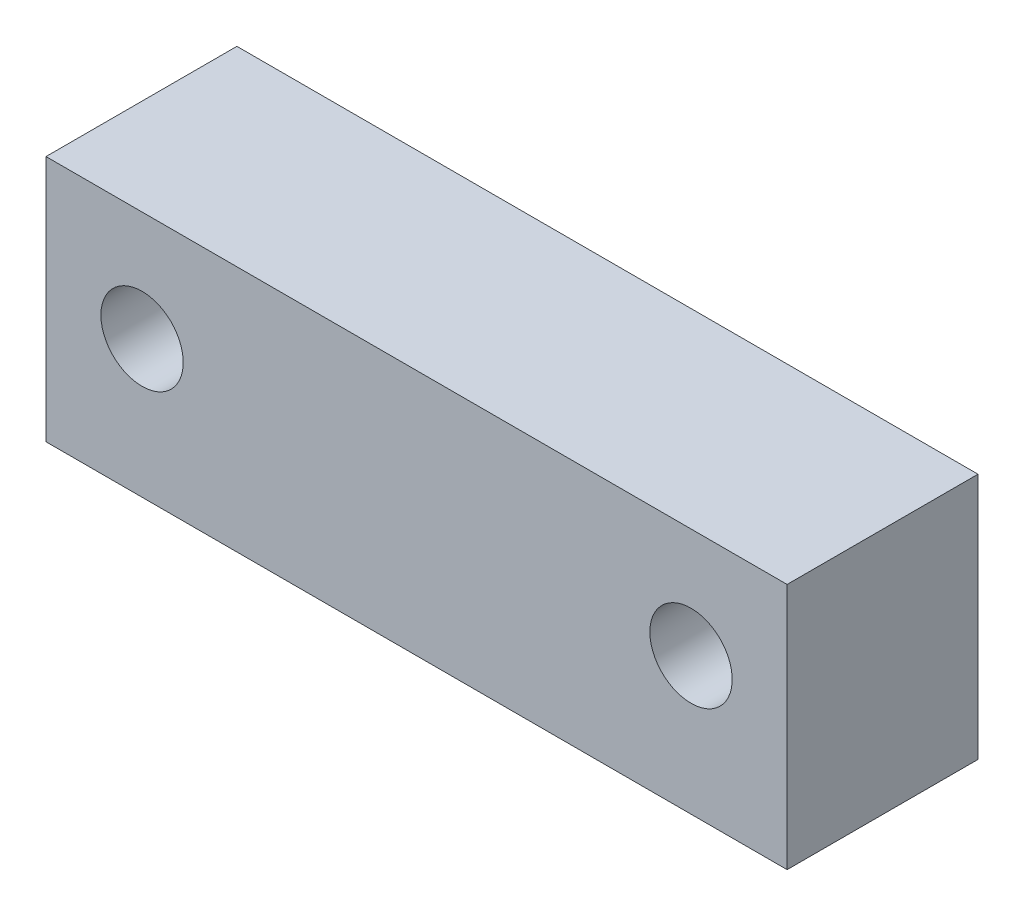
ISO-10303-21;
HEADER;
FILE_DESCRIPTION(('STEP AP214'),'2;1');
FILE_NAME('part.step','',(''),(''),'','','');
FILE_SCHEMA(('AUTOMOTIVE_DESIGN { 1 0 10303 214 1 1 1 1 }'));
ENDSEC;
DATA;
#1=APPLICATION_CONTEXT('core data for automotive mechanical design processes');
#2=APPLICATION_PROTOCOL_DEFINITION('international standard','automotive_design',2000,#1);
#3=PRODUCT_CONTEXT('',#1,'mechanical');
#4=PRODUCT('Part','Part','',(#3));
#5=PRODUCT_RELATED_PRODUCT_CATEGORY('part','',(#4));
#6=PRODUCT_DEFINITION_FORMATION('','',#4);
#7=PRODUCT_DEFINITION_CONTEXT('part definition',#1,'design');
#8=PRODUCT_DEFINITION('design','',#6,#7);
#9=PRODUCT_DEFINITION_SHAPE('','',#8);
#10=(LENGTH_UNIT() NAMED_UNIT(*) SI_UNIT(.MILLI.,.METRE.));
#11=(NAMED_UNIT(*) PLANE_ANGLE_UNIT() SI_UNIT($,.RADIAN.));
#12=(NAMED_UNIT(*) SI_UNIT($,.STERADIAN.) SOLID_ANGLE_UNIT());
#13=UNCERTAINTY_MEASURE_WITH_UNIT(LENGTH_MEASURE(1.E-05),#10,'distance_accuracy_value','');
#14=(GEOMETRIC_REPRESENTATION_CONTEXT(3) GLOBAL_UNCERTAINTY_ASSIGNED_CONTEXT((#13)) GLOBAL_UNIT_ASSIGNED_CONTEXT((#10,
#11,#12)) REPRESENTATION_CONTEXT('',''));
#15=CARTESIAN_POINT('',(0.,0.,0.));
#16=DIRECTION('',(0.,0.,1.));
#17=DIRECTION('',(1.,0.,0.));
#18=AXIS2_PLACEMENT_3D('',#15,#16,#17);
#19=CARTESIAN_POINT('',(0.,0.,13.91));
#20=DIRECTION('',(0.,0.,-1.));
#21=DIRECTION('',(-1.,0.,0.));
#22=AXIS2_PLACEMENT_3D('',#19,#20,#21);
#23=PLANE('',#22);
#24=DIRECTION('',(1.,0.,0.));
#25=VECTOR('',#24,1.);
#26=CARTESIAN_POINT('',(-27.,-18.,13.91));
#27=LINE('',#26,#25);
#28=CARTESIAN_POINT('',(-27.,-18.,13.91));
#29=VERTEX_POINT('',#28);
#30=CARTESIAN_POINT('',(27.,-18.,13.91));
#31=VERTEX_POINT('',#30);
#32=EDGE_CURVE('E84',#29,#31,#27,.T.);
#33=ORIENTED_EDGE('',*,*,#32,.T.);
#34=DIRECTION('',(0.,1.,0.));
#35=VECTOR('',#34,1.);
#36=CARTESIAN_POINT('',(27.,0.,13.91));
#37=LINE('',#36,#35);
#38=CARTESIAN_POINT('',(27.,0.,13.91));
#39=VERTEX_POINT('',#38);
#40=EDGE_CURVE('E79',#31,#39,#37,.T.);
#41=ORIENTED_EDGE('',*,*,#40,.T.);
#42=DIRECTION('',(-1.,0.,0.));
#43=VECTOR('',#42,1.);
#44=CARTESIAN_POINT('',(-27.,0.,13.91));
#45=LINE('',#44,#43);
#46=CARTESIAN_POINT('',(-27.,0.,13.91));
#47=VERTEX_POINT('',#46);
#48=EDGE_CURVE('E82',#39,#47,#45,.T.);
#49=ORIENTED_EDGE('',*,*,#48,.T.);
#50=DIRECTION('',(0.,-1.,0.));
#51=VECTOR('',#50,1.);
#52=CARTESIAN_POINT('',(-27.,0.,13.91));
#53=LINE('',#52,#51);
#54=EDGE_CURVE('E49',#47,#29,#53,.T.);
#55=ORIENTED_EDGE('',*,*,#54,.T.);
#56=EDGE_LOOP('',(#33,#41,#49,#55));
#57=FACE_BOUND('',#56,.T.);
#58=CARTESIAN_POINT('',(-20.,-8.,13.91));
#59=DIRECTION('',(0.,0.,1.));
#60=DIRECTION('',(1.,0.,0.));
#61=AXIS2_PLACEMENT_3D('',#58,#59,#60);
#62=CIRCLE('',#61,2.99999999999999);
#63=CARTESIAN_POINT('',(-23.,-8.,13.91));
#64=VERTEX_POINT('',#63);
#65=EDGE_CURVE('E99',#64,#64,#62,.T.);
#66=ORIENTED_EDGE('',*,*,#65,.F.);
#67=EDGE_LOOP('',(#66));
#68=FACE_BOUND('',#67,.T.);
#69=CARTESIAN_POINT('',(20.,-8.,13.91));
#70=DIRECTION('',(0.,0.,1.));
#71=DIRECTION('',(1.,0.,0.));
#72=AXIS2_PLACEMENT_3D('',#69,#70,#71);
#73=CIRCLE('',#72,2.99999999999999);
#74=CARTESIAN_POINT('',(17.,-8.,13.91));
#75=VERTEX_POINT('',#74);
#76=EDGE_CURVE('E114',#75,#75,#73,.T.);
#77=ORIENTED_EDGE('',*,*,#76,.F.);
#78=EDGE_LOOP('',(#77));
#79=FACE_BOUND('',#78,.T.);
#80=ADVANCED_FACE('F32',(#57,#68,#79),#23,.F.);
#81=CARTESIAN_POINT('',(0.,0.,0.));
#82=DIRECTION('',(0.,0.,-1.));
#83=DIRECTION('',(-1.,0.,0.));
#84=AXIS2_PLACEMENT_3D('',#81,#82,#83);
#85=PLANE('',#84);
#86=CARTESIAN_POINT('',(-20.,-8.,0.));
#87=DIRECTION('',(0.,0.,1.));
#88=DIRECTION('',(1.,0.,0.));
#89=AXIS2_PLACEMENT_3D('',#86,#87,#88);
#90=CIRCLE('',#89,2.99999999999999);
#91=CARTESIAN_POINT('',(-23.,-8.,0.));
#92=VERTEX_POINT('',#91);
#93=EDGE_CURVE('E111',#92,#92,#90,.T.);
#94=ORIENTED_EDGE('',*,*,#93,.T.);
#95=EDGE_LOOP('',(#94));
#96=FACE_BOUND('',#95,.T.);
#97=DIRECTION('',(1.,0.,0.));
#98=VECTOR('',#97,1.);
#99=CARTESIAN_POINT('',(-27.,-18.,0.));
#100=LINE('',#99,#98);
#101=CARTESIAN_POINT('',(-27.,-18.,0.));
#102=VERTEX_POINT('',#101);
#103=CARTESIAN_POINT('',(27.,-18.,0.));
#104=VERTEX_POINT('',#103);
#105=EDGE_CURVE('E96',#102,#104,#100,.T.);
#106=ORIENTED_EDGE('',*,*,#105,.F.);
#107=DIRECTION('',(0.,-1.,0.));
#108=VECTOR('',#107,1.);
#109=CARTESIAN_POINT('',(-27.,0.,0.));
#110=LINE('',#109,#108);
#111=CARTESIAN_POINT('',(-27.,0.,0.));
#112=VERTEX_POINT('',#111);
#113=EDGE_CURVE('E72',#112,#102,#110,.T.);
#114=ORIENTED_EDGE('',*,*,#113,.F.);
#115=DIRECTION('',(-1.,0.,0.));
#116=VECTOR('',#115,1.);
#117=CARTESIAN_POINT('',(-27.,0.,0.));
#118=LINE('',#117,#116);
#119=CARTESIAN_POINT('',(27.,0.,0.));
#120=VERTEX_POINT('',#119);
#121=EDGE_CURVE('E66',#120,#112,#118,.T.);
#122=ORIENTED_EDGE('',*,*,#121,.F.);
#123=DIRECTION('',(0.,1.,0.));
#124=VECTOR('',#123,1.);
#125=CARTESIAN_POINT('',(27.,0.,0.));
#126=LINE('',#125,#124);
#127=EDGE_CURVE('E88',#104,#120,#126,.T.);
#128=ORIENTED_EDGE('',*,*,#127,.F.);
#129=EDGE_LOOP('',(#106,#114,#122,#128));
#130=FACE_BOUND('',#129,.T.);
#131=CARTESIAN_POINT('',(20.,-8.,0.));
#132=DIRECTION('',(0.,0.,1.));
#133=DIRECTION('',(1.,0.,0.));
#134=AXIS2_PLACEMENT_3D('',#131,#132,#133);
#135=CIRCLE('',#134,2.99999999999999);
#136=CARTESIAN_POINT('',(17.,-8.,0.));
#137=VERTEX_POINT('',#136);
#138=EDGE_CURVE('E117',#137,#137,#135,.T.);
#139=ORIENTED_EDGE('',*,*,#138,.T.);
#140=EDGE_LOOP('',(#139));
#141=FACE_BOUND('',#140,.T.);
#142=ADVANCED_FACE('F107',(#96,#130,#141),#85,.T.);
#143=CARTESIAN_POINT('',(-27.,-18.,13.91));
#144=DIRECTION('',(0.,1.,0.));
#145=DIRECTION('',(0.,0.,1.));
#146=AXIS2_PLACEMENT_3D('',#143,#144,#145);
#147=PLANE('',#146);
#148=ORIENTED_EDGE('',*,*,#105,.T.);
#149=DIRECTION('',(0.,0.,-1.));
#150=VECTOR('',#149,1.);
#151=CARTESIAN_POINT('',(27.,-18.,13.91));
#152=LINE('',#151,#150);
#153=EDGE_CURVE('E11',#31,#104,#152,.T.);
#154=ORIENTED_EDGE('',*,*,#153,.F.);
#155=ORIENTED_EDGE('',*,*,#32,.F.);
#156=DIRECTION('',(0.,0.,-1.));
#157=VECTOR('',#156,1.);
#158=CARTESIAN_POINT('',(-27.,-18.,13.91));
#159=LINE('',#158,#157);
#160=EDGE_CURVE('E92',#29,#102,#159,.T.);
#161=ORIENTED_EDGE('',*,*,#160,.T.);
#162=EDGE_LOOP('',(#148,#154,#155,#161));
#163=FACE_BOUND('',#162,.T.);
#164=ADVANCED_FACE('F34',(#163),#147,.F.);
#165=CARTESIAN_POINT('',(27.,0.,13.91));
#166=DIRECTION('',(-1.,0.,0.));
#167=DIRECTION('',(0.,0.,1.));
#168=AXIS2_PLACEMENT_3D('',#165,#166,#167);
#169=PLANE('',#168);
#170=ORIENTED_EDGE('',*,*,#127,.T.);
#171=DIRECTION('',(0.,0.,-1.));
#172=VECTOR('',#171,1.);
#173=CARTESIAN_POINT('',(27.,0.,13.91));
#174=LINE('',#173,#172);
#175=EDGE_CURVE('E41',#39,#120,#174,.T.);
#176=ORIENTED_EDGE('',*,*,#175,.F.);
#177=ORIENTED_EDGE('',*,*,#40,.F.);
#178=ORIENTED_EDGE('',*,*,#153,.T.);
#179=EDGE_LOOP('',(#170,#176,#177,#178));
#180=FACE_BOUND('',#179,.T.);
#181=ADVANCED_FACE('F87',(#180),#169,.F.);
#182=CARTESIAN_POINT('',(-27.,0.,13.91));
#183=DIRECTION('',(0.,-1.,0.));
#184=DIRECTION('',(0.,0.,-1.));
#185=AXIS2_PLACEMENT_3D('',#182,#183,#184);
#186=PLANE('',#185);
#187=ORIENTED_EDGE('',*,*,#121,.T.);
#188=DIRECTION('',(0.,0.,-1.));
#189=VECTOR('',#188,1.);
#190=CARTESIAN_POINT('',(-27.,0.,13.91));
#191=LINE('',#190,#189);
#192=EDGE_CURVE('E89',#47,#112,#191,.T.);
#193=ORIENTED_EDGE('',*,*,#192,.F.);
#194=ORIENTED_EDGE('',*,*,#48,.F.);
#195=ORIENTED_EDGE('',*,*,#175,.T.);
#196=EDGE_LOOP('',(#187,#193,#194,#195));
#197=FACE_BOUND('',#196,.T.);
#198=ADVANCED_FACE('F90',(#197),#186,.F.);
#199=CARTESIAN_POINT('',(-27.,0.,13.91));
#200=DIRECTION('',(1.,0.,0.));
#201=DIRECTION('',(0.,1.,0.));
#202=AXIS2_PLACEMENT_3D('',#199,#200,#201);
#203=PLANE('',#202);
#204=ORIENTED_EDGE('',*,*,#113,.T.);
#205=ORIENTED_EDGE('',*,*,#160,.F.);
#206=ORIENTED_EDGE('',*,*,#54,.F.);
#207=ORIENTED_EDGE('',*,*,#192,.T.);
#208=EDGE_LOOP('',(#204,#205,#206,#207));
#209=FACE_BOUND('',#208,.T.);
#210=ADVANCED_FACE('F104',(#209),#203,.F.);
#211=CARTESIAN_POINT('',(-20.,-8.,13.91));
#212=DIRECTION('',(0.,0.,-1.));
#213=DIRECTION('',(-1.,0.,0.));
#214=AXIS2_PLACEMENT_3D('',#211,#212,#213);
#215=CYLINDRICAL_SURFACE('',#214,2.99999999999999);
#216=CARTESIAN_POINT('',(-23.,-8.,13.91));
#217=CARTESIAN_POINT('',(-23.,-8.,13.7651041666667));
#218=CARTESIAN_POINT('',(-23.,-8.,13.6202083333333));
#219=CARTESIAN_POINT('',(-23.,-8.,13.3304166666667));
#220=CARTESIAN_POINT('',(-23.,-8.,13.1855208333333));
#221=CARTESIAN_POINT('',(-23.,-8.,12.8957291666667));
#222=CARTESIAN_POINT('',(-23.,-8.,12.7508333333333));
#223=CARTESIAN_POINT('',(-23.,-8.,12.4610416666667));
#224=CARTESIAN_POINT('',(-23.,-8.,12.3161458333333));
#225=CARTESIAN_POINT('',(-23.,-8.,12.0263541666667));
#226=CARTESIAN_POINT('',(-23.,-8.,11.8814583333333));
#227=CARTESIAN_POINT('',(-23.,-8.,11.5916666666667));
#228=CARTESIAN_POINT('',(-23.,-8.,11.4467708333333));
#229=CARTESIAN_POINT('',(-23.,-8.,11.1569791666667));
#230=CARTESIAN_POINT('',(-23.,-8.,11.0120833333333));
#231=CARTESIAN_POINT('',(-23.,-8.,10.7222916666667));
#232=CARTESIAN_POINT('',(-23.,-8.,10.5773958333333));
#233=CARTESIAN_POINT('',(-23.,-8.,10.2876041666667));
#234=CARTESIAN_POINT('',(-23.,-8.,10.1427083333333));
#235=CARTESIAN_POINT('',(-23.,-8.,9.85291666666667));
#236=CARTESIAN_POINT('',(-23.,-8.,9.70802083333333));
#237=CARTESIAN_POINT('',(-23.,-8.,9.41822916666667));
#238=CARTESIAN_POINT('',(-23.,-8.,9.27333333333333));
#239=CARTESIAN_POINT('',(-23.,-8.,8.98354166666667));
#240=CARTESIAN_POINT('',(-23.,-8.,8.83864583333333));
#241=CARTESIAN_POINT('',(-23.,-8.,8.54885416666667));
#242=CARTESIAN_POINT('',(-23.,-8.,8.40395833333333));
#243=CARTESIAN_POINT('',(-23.,-8.,8.11416666666667));
#244=CARTESIAN_POINT('',(-23.,-8.,7.96927083333334));
#245=CARTESIAN_POINT('',(-23.,-8.,7.67947916666667));
#246=CARTESIAN_POINT('',(-23.,-8.,7.53458333333333));
#247=CARTESIAN_POINT('',(-23.,-8.,7.24479166666667));
#248=CARTESIAN_POINT('',(-23.,-8.,7.09989583333333));
#249=CARTESIAN_POINT('',(-23.,-8.,6.81010416666667));
#250=CARTESIAN_POINT('',(-23.,-8.,6.66520833333333));
#251=CARTESIAN_POINT('',(-23.,-8.,6.37541666666667));
#252=CARTESIAN_POINT('',(-23.,-8.,6.23052083333333));
#253=CARTESIAN_POINT('',(-23.,-8.,5.94072916666667));
#254=CARTESIAN_POINT('',(-23.,-8.,5.79583333333333));
#255=CARTESIAN_POINT('',(-23.,-8.,5.50604166666667));
#256=CARTESIAN_POINT('',(-23.,-8.,5.36114583333333));
#257=CARTESIAN_POINT('',(-23.,-8.,5.07135416666667));
#258=CARTESIAN_POINT('',(-23.,-8.,4.92645833333333));
#259=CARTESIAN_POINT('',(-23.,-8.,4.63666666666667));
#260=CARTESIAN_POINT('',(-23.,-8.,4.49177083333333));
#261=CARTESIAN_POINT('',(-23.,-8.,4.20197916666667));
#262=CARTESIAN_POINT('',(-23.,-8.,4.05708333333333));
#263=CARTESIAN_POINT('',(-23.,-8.,3.76729166666667));
#264=CARTESIAN_POINT('',(-23.,-8.,3.62239583333333));
#265=CARTESIAN_POINT('',(-23.,-8.,3.33260416666667));
#266=CARTESIAN_POINT('',(-23.,-8.,3.18770833333333));
#267=CARTESIAN_POINT('',(-23.,-8.,2.89791666666667));
#268=CARTESIAN_POINT('',(-23.,-8.,2.75302083333333));
#269=CARTESIAN_POINT('',(-23.,-8.,2.46322916666667));
#270=CARTESIAN_POINT('',(-23.,-8.,2.31833333333333));
#271=CARTESIAN_POINT('',(-23.,-8.,2.02854166666667));
#272=CARTESIAN_POINT('',(-23.,-8.,1.88364583333333));
#273=CARTESIAN_POINT('',(-23.,-8.,1.59385416666667));
#274=CARTESIAN_POINT('',(-23.,-8.,1.44895833333333));
#275=CARTESIAN_POINT('',(-23.,-8.,1.15916666666667));
#276=CARTESIAN_POINT('',(-23.,-8.,1.01427083333333));
#277=CARTESIAN_POINT('',(-23.,-8.,0.724479166666667));
#278=CARTESIAN_POINT('',(-23.,-8.,0.579583333333333));
#279=CARTESIAN_POINT('',(-23.,-8.,0.289791666666666));
#280=CARTESIAN_POINT('',(-23.,-8.,0.144895833333333));
#281=CARTESIAN_POINT('',(-23.,-8.,0.));
#282=B_SPLINE_CURVE_WITH_KNOTS('',3,(#216,#217,#218,#219,#220,#221,#222,#223,#224,#225,#226,
#227,#228,#229,#230,#231,#232,#233,#234,#235,#236,#237,#238,#239,#240,#241,#242,#243,#244,#245,
#246,#247,#248,#249,#250,#251,#252,#253,#254,#255,#256,#257,#258,#259,#260,#261,#262,#263,#264,
#265,#266,#267,#268,#269,#270,#271,#272,#273,#274,#275,#276,#277,#278,#279,#280,#281),
.UNSPECIFIED.,.F.,.F.,(4,2,2,2,2,2,2,2,2,2,2,2,2,2,2,2,2,2,2,2,2,2,2,2,2,2,2,2,2,2,2,2,4),(0.,
0.434687499999999,0.869374999999999,1.3040625,1.73875,2.1734375,2.608125,3.0428125,3.4775,
3.9121875,4.346875,4.7815625,5.21625,5.6509375,6.085625,6.5203125,6.955,7.3896875,7.824375,
8.2590625,8.69375,9.1284375,9.563125,9.9978125,10.4325,10.8671875,11.301875,11.7365625,12.17125,
12.6059375,13.040625,13.4753125,13.91),.UNSPECIFIED.);
#283=EDGE_CURVE('BSEAM134',#64,#92,#282,.T.);
#284=ORIENTED_EDGE('',*,*,#65,.T.);
#285=ORIENTED_EDGE('',*,*,#93,.F.);
#286=ORIENTED_EDGE('',*,*,#283,.T.);
#287=ORIENTED_EDGE('',*,*,#283,.F.);
#288=EDGE_LOOP('',(#284,#286,#285,#287));
#289=FACE_BOUND('',#288,.T.);
#290=ADVANCED_FACE('F134',(#289),#215,.F.);
#291=CARTESIAN_POINT('',(20.,-8.,13.91));
#292=DIRECTION('',(0.,0.,-1.));
#293=DIRECTION('',(-1.,0.,0.));
#294=AXIS2_PLACEMENT_3D('',#291,#292,#293);
#295=CYLINDRICAL_SURFACE('',#294,2.99999999999999);
#296=CARTESIAN_POINT('',(17.,-8.,13.91));
#297=CARTESIAN_POINT('',(17.,-8.,13.7651041666667));
#298=CARTESIAN_POINT('',(17.,-8.,13.6202083333333));
#299=CARTESIAN_POINT('',(17.,-8.,13.3304166666667));
#300=CARTESIAN_POINT('',(17.,-8.,13.1855208333333));
#301=CARTESIAN_POINT('',(17.,-8.,12.8957291666667));
#302=CARTESIAN_POINT('',(17.,-8.,12.7508333333333));
#303=CARTESIAN_POINT('',(17.,-8.,12.4610416666667));
#304=CARTESIAN_POINT('',(17.,-8.,12.3161458333333));
#305=CARTESIAN_POINT('',(17.,-8.,12.0263541666667));
#306=CARTESIAN_POINT('',(17.,-8.,11.8814583333333));
#307=CARTESIAN_POINT('',(17.,-8.,11.5916666666667));
#308=CARTESIAN_POINT('',(17.,-8.,11.4467708333333));
#309=CARTESIAN_POINT('',(17.,-8.,11.1569791666667));
#310=CARTESIAN_POINT('',(17.,-8.,11.0120833333333));
#311=CARTESIAN_POINT('',(17.,-8.,10.7222916666667));
#312=CARTESIAN_POINT('',(17.,-8.,10.5773958333333));
#313=CARTESIAN_POINT('',(17.,-8.,10.2876041666667));
#314=CARTESIAN_POINT('',(17.,-8.,10.1427083333333));
#315=CARTESIAN_POINT('',(17.,-8.,9.85291666666667));
#316=CARTESIAN_POINT('',(17.,-8.,9.70802083333333));
#317=CARTESIAN_POINT('',(17.,-8.,9.41822916666667));
#318=CARTESIAN_POINT('',(17.,-8.,9.27333333333333));
#319=CARTESIAN_POINT('',(17.,-8.,8.98354166666667));
#320=CARTESIAN_POINT('',(17.,-8.,8.83864583333333));
#321=CARTESIAN_POINT('',(17.,-8.,8.54885416666667));
#322=CARTESIAN_POINT('',(17.,-8.,8.40395833333333));
#323=CARTESIAN_POINT('',(17.,-8.,8.11416666666667));
#324=CARTESIAN_POINT('',(17.,-8.,7.96927083333334));
#325=CARTESIAN_POINT('',(17.,-8.,7.67947916666667));
#326=CARTESIAN_POINT('',(17.,-8.,7.53458333333333));
#327=CARTESIAN_POINT('',(17.,-8.,7.24479166666667));
#328=CARTESIAN_POINT('',(17.,-8.,7.09989583333333));
#329=CARTESIAN_POINT('',(17.,-8.,6.81010416666667));
#330=CARTESIAN_POINT('',(17.,-8.,6.66520833333333));
#331=CARTESIAN_POINT('',(17.,-8.,6.37541666666667));
#332=CARTESIAN_POINT('',(17.,-8.,6.23052083333333));
#333=CARTESIAN_POINT('',(17.,-8.,5.94072916666667));
#334=CARTESIAN_POINT('',(17.,-8.,5.79583333333333));
#335=CARTESIAN_POINT('',(17.,-8.,5.50604166666667));
#336=CARTESIAN_POINT('',(17.,-8.,5.36114583333333));
#337=CARTESIAN_POINT('',(17.,-8.,5.07135416666667));
#338=CARTESIAN_POINT('',(17.,-8.,4.92645833333333));
#339=CARTESIAN_POINT('',(17.,-8.,4.63666666666667));
#340=CARTESIAN_POINT('',(17.,-8.,4.49177083333333));
#341=CARTESIAN_POINT('',(17.,-8.,4.20197916666667));
#342=CARTESIAN_POINT('',(17.,-8.,4.05708333333333));
#343=CARTESIAN_POINT('',(17.,-8.,3.76729166666667));
#344=CARTESIAN_POINT('',(17.,-8.,3.62239583333333));
#345=CARTESIAN_POINT('',(17.,-8.,3.33260416666667));
#346=CARTESIAN_POINT('',(17.,-8.,3.18770833333333));
#347=CARTESIAN_POINT('',(17.,-8.,2.89791666666667));
#348=CARTESIAN_POINT('',(17.,-8.,2.75302083333333));
#349=CARTESIAN_POINT('',(17.,-8.,2.46322916666667));
#350=CARTESIAN_POINT('',(17.,-8.,2.31833333333333));
#351=CARTESIAN_POINT('',(17.,-8.,2.02854166666667));
#352=CARTESIAN_POINT('',(17.,-8.,1.88364583333333));
#353=CARTESIAN_POINT('',(17.,-8.,1.59385416666667));
#354=CARTESIAN_POINT('',(17.,-8.,1.44895833333333));
#355=CARTESIAN_POINT('',(17.,-8.,1.15916666666667));
#356=CARTESIAN_POINT('',(17.,-8.,1.01427083333333));
#357=CARTESIAN_POINT('',(17.,-8.,0.724479166666667));
#358=CARTESIAN_POINT('',(17.,-8.,0.579583333333333));
#359=CARTESIAN_POINT('',(17.,-8.,0.289791666666666));
#360=CARTESIAN_POINT('',(17.,-8.,0.144895833333333));
#361=CARTESIAN_POINT('',(17.,-8.,0.));
#362=B_SPLINE_CURVE_WITH_KNOTS('',3,(#296,#297,#298,#299,#300,#301,#302,#303,#304,#305,#306,
#307,#308,#309,#310,#311,#312,#313,#314,#315,#316,#317,#318,#319,#320,#321,#322,#323,#324,#325,
#326,#327,#328,#329,#330,#331,#332,#333,#334,#335,#336,#337,#338,#339,#340,#341,#342,#343,#344,
#345,#346,#347,#348,#349,#350,#351,#352,#353,#354,#355,#356,#357,#358,#359,#360,#361),
.UNSPECIFIED.,.F.,.F.,(4,2,2,2,2,2,2,2,2,2,2,2,2,2,2,2,2,2,2,2,2,2,2,2,2,2,2,2,2,2,2,2,4),(0.,
0.434687499999999,0.869374999999999,1.3040625,1.73875,2.1734375,2.608125,3.0428125,3.4775,
3.9121875,4.346875,4.7815625,5.21625,5.6509375,6.085625,6.5203125,6.955,7.3896875,7.824375,
8.2590625,8.69375,9.1284375,9.563125,9.9978125,10.4325,10.8671875,11.301875,11.7365625,12.17125,
12.6059375,13.040625,13.4753125,13.91),.UNSPECIFIED.);
#363=EDGE_CURVE('BSEAM123',#75,#137,#362,.T.);
#364=ORIENTED_EDGE('',*,*,#76,.T.);
#365=ORIENTED_EDGE('',*,*,#138,.F.);
#366=ORIENTED_EDGE('',*,*,#363,.T.);
#367=ORIENTED_EDGE('',*,*,#363,.F.);
#368=EDGE_LOOP('',(#364,#366,#365,#367));
#369=FACE_BOUND('',#368,.T.);
#370=ADVANCED_FACE('F123',(#369),#295,.F.);
#371=CLOSED_SHELL('',(#80,#142,#164,#181,#198,#210,#290,#370));
#372=MANIFOLD_SOLID_BREP('B2',#371);
#373=ADVANCED_BREP_SHAPE_REPRESENTATION('',(#18,#372),#14);
#374=SHAPE_DEFINITION_REPRESENTATION(#9,#373);
ENDSEC;
END-ISO-10303-21;
